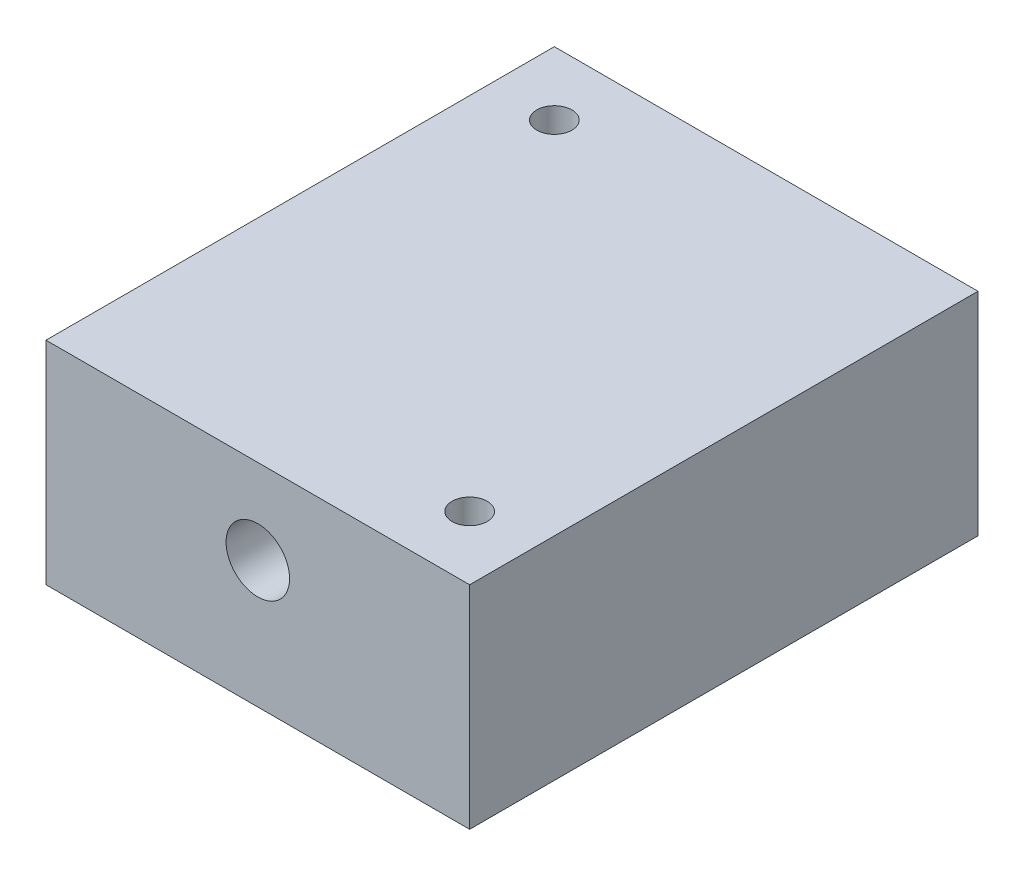
ISO-10303-21;
HEADER;
FILE_DESCRIPTION(('STEP AP214'),'2;1');
FILE_NAME('part.step','',(''),(''),'','','');
FILE_SCHEMA(('AUTOMOTIVE_DESIGN { 1 0 10303 214 1 1 1 1 }'));
ENDSEC;
DATA;
#1=APPLICATION_CONTEXT('core data for automotive mechanical design processes');
#2=APPLICATION_PROTOCOL_DEFINITION('international standard','automotive_design',2000,#1);
#3=PRODUCT_CONTEXT('',#1,'mechanical');
#4=PRODUCT('Part','Part','',(#3));
#5=PRODUCT_RELATED_PRODUCT_CATEGORY('part','',(#4));
#6=PRODUCT_DEFINITION_FORMATION('','',#4);
#7=PRODUCT_DEFINITION_CONTEXT('part definition',#1,'design');
#8=PRODUCT_DEFINITION('design','',#6,#7);
#9=PRODUCT_DEFINITION_SHAPE('','',#8);
#10=(LENGTH_UNIT() NAMED_UNIT(*) SI_UNIT(.MILLI.,.METRE.));
#11=(NAMED_UNIT(*) PLANE_ANGLE_UNIT() SI_UNIT($,.RADIAN.));
#12=(NAMED_UNIT(*) SI_UNIT($,.STERADIAN.) SOLID_ANGLE_UNIT());
#13=UNCERTAINTY_MEASURE_WITH_UNIT(LENGTH_MEASURE(1.E-05),#10,'distance_accuracy_value','');
#14=(GEOMETRIC_REPRESENTATION_CONTEXT(3) GLOBAL_UNCERTAINTY_ASSIGNED_CONTEXT((#13)) GLOBAL_UNIT_ASSIGNED_CONTEXT((#10,
#11,#12)) REPRESENTATION_CONTEXT('',''));
#15=CARTESIAN_POINT('',(0.,0.,0.));
#16=DIRECTION('',(0.,0.,1.));
#17=DIRECTION('',(1.,0.,0.));
#18=AXIS2_PLACEMENT_3D('',#15,#16,#17);
#19=CARTESIAN_POINT('',(-50.,-25.,120.));
#20=DIRECTION('',(1.,0.,0.));
#21=DIRECTION('',(0.,1.,0.));
#22=AXIS2_PLACEMENT_3D('',#19,#20,#21);
#23=PLANE('',#22);
#24=DIRECTION('',(0.,-1.,0.));
#25=VECTOR('',#24,1.);
#26=CARTESIAN_POINT('',(-50.,-25.,0.));
#27=LINE('',#26,#25);
#28=CARTESIAN_POINT('',(-50.,25.,0.));
#29=VERTEX_POINT('',#28);
#30=CARTESIAN_POINT('',(-50.,-25.,0.));
#31=VERTEX_POINT('',#30);
#32=EDGE_CURVE('E110',#29,#31,#27,.T.);
#33=ORIENTED_EDGE('',*,*,#32,.T.);
#34=DIRECTION('',(0.,0.,-1.));
#35=VECTOR('',#34,1.);
#36=CARTESIAN_POINT('',(-50.,-25.,120.));
#37=LINE('',#36,#35);
#38=CARTESIAN_POINT('',(-50.,-25.,120.));
#39=VERTEX_POINT('',#38);
#40=EDGE_CURVE('E11',#39,#31,#37,.T.);
#41=ORIENTED_EDGE('',*,*,#40,.F.);
#42=DIRECTION('',(0.,-1.,0.));
#43=VECTOR('',#42,1.);
#44=CARTESIAN_POINT('',(-50.,-25.,120.));
#45=LINE('',#44,#43);
#46=CARTESIAN_POINT('',(-50.,25.,120.));
#47=VERTEX_POINT('',#46);
#48=EDGE_CURVE('E111',#47,#39,#45,.T.);
#49=ORIENTED_EDGE('',*,*,#48,.F.);
#50=DIRECTION('',(0.,0.,-1.));
#51=VECTOR('',#50,1.);
#52=CARTESIAN_POINT('',(-50.,25.,120.));
#53=LINE('',#52,#51);
#54=EDGE_CURVE('E117',#47,#29,#53,.T.);
#55=ORIENTED_EDGE('',*,*,#54,.T.);
#56=EDGE_LOOP('',(#33,#41,#49,#55));
#57=FACE_BOUND('',#56,.T.);
#58=ADVANCED_FACE('F33',(#57),#23,.F.);
#59=CARTESIAN_POINT('',(50.,-25.,120.));
#60=DIRECTION('',(0.,1.,0.));
#61=DIRECTION('',(-1.,0.,0.));
#62=AXIS2_PLACEMENT_3D('',#59,#60,#61);
#63=PLANE('',#62);
#64=DIRECTION('',(1.,0.,0.));
#65=VECTOR('',#64,1.);
#66=CARTESIAN_POINT('',(50.,-25.,0.));
#67=LINE('',#66,#65);
#68=CARTESIAN_POINT('',(50.,-25.,0.));
#69=VERTEX_POINT('',#68);
#70=EDGE_CURVE('E120',#31,#69,#67,.T.);
#71=ORIENTED_EDGE('',*,*,#70,.T.);
#72=DIRECTION('',(0.,0.,-1.));
#73=VECTOR('',#72,1.);
#74=CARTESIAN_POINT('',(50.,-25.,120.));
#75=LINE('',#74,#73);
#76=CARTESIAN_POINT('',(50.,-25.,120.));
#77=VERTEX_POINT('',#76);
#78=EDGE_CURVE('E41',#77,#69,#75,.T.);
#79=ORIENTED_EDGE('',*,*,#78,.F.);
#80=DIRECTION('',(1.,0.,0.));
#81=VECTOR('',#80,1.);
#82=CARTESIAN_POINT('',(50.,-25.,120.));
#83=LINE('',#82,#81);
#84=EDGE_CURVE('E80',#39,#77,#83,.T.);
#85=ORIENTED_EDGE('',*,*,#84,.F.);
#86=ORIENTED_EDGE('',*,*,#40,.T.);
#87=EDGE_LOOP('',(#71,#79,#85,#86));
#88=FACE_BOUND('',#87,.T.);
#89=ADVANCED_FACE('F146',(#88),#63,.F.);
#90=CARTESIAN_POINT('',(50.,-25.,120.));
#91=DIRECTION('',(-1.,0.,0.));
#92=DIRECTION('',(0.,-1.,0.));
#93=AXIS2_PLACEMENT_3D('',#90,#91,#92);
#94=PLANE('',#93);
#95=DIRECTION('',(0.,1.,0.));
#96=VECTOR('',#95,1.);
#97=CARTESIAN_POINT('',(50.,-25.,0.));
#98=LINE('',#97,#96);
#99=CARTESIAN_POINT('',(50.,25.,0.));
#100=VERTEX_POINT('',#99);
#101=EDGE_CURVE('E67',#69,#100,#98,.T.);
#102=ORIENTED_EDGE('',*,*,#101,.T.);
#103=DIRECTION('',(0.,0.,-1.));
#104=VECTOR('',#103,1.);
#105=CARTESIAN_POINT('',(50.,25.,120.));
#106=LINE('',#105,#104);
#107=CARTESIAN_POINT('',(50.,25.,120.));
#108=VERTEX_POINT('',#107);
#109=EDGE_CURVE('E125',#108,#100,#106,.T.);
#110=ORIENTED_EDGE('',*,*,#109,.F.);
#111=DIRECTION('',(0.,1.,0.));
#112=VECTOR('',#111,1.);
#113=CARTESIAN_POINT('',(50.,-25.,120.));
#114=LINE('',#113,#112);
#115=EDGE_CURVE('E114',#77,#108,#114,.T.);
#116=ORIENTED_EDGE('',*,*,#115,.F.);
#117=ORIENTED_EDGE('',*,*,#78,.T.);
#118=EDGE_LOOP('',(#102,#110,#116,#117));
#119=FACE_BOUND('',#118,.T.);
#120=ADVANCED_FACE('F127',(#119),#94,.F.);
#121=CARTESIAN_POINT('',(50.,25.,120.));
#122=DIRECTION('',(0.,-1.,0.));
#123=DIRECTION('',(1.,0.,0.));
#124=AXIS2_PLACEMENT_3D('',#121,#122,#123);
#125=PLANE('',#124);
#126=CARTESIAN_POINT('',(35.,25.,105.));
#127=DIRECTION('',(0.,1.,0.));
#128=DIRECTION('',(0.,0.,1.));
#129=AXIS2_PLACEMENT_3D('',#126,#127,#128);
#130=CIRCLE('',#129,4.14999999999999);
#131=CARTESIAN_POINT('',(35.,25.,109.15));
#132=VERTEX_POINT('',#131);
#133=EDGE_CURVE('E98',#132,#132,#130,.T.);
#134=ORIENTED_EDGE('',*,*,#133,.F.);
#135=EDGE_LOOP('',(#134));
#136=FACE_BOUND('',#135,.T.);
#137=CARTESIAN_POINT('',(-35.,25.,15.));
#138=DIRECTION('',(0.,1.,0.));
#139=DIRECTION('',(0.,0.,1.));
#140=AXIS2_PLACEMENT_3D('',#137,#138,#139);
#141=CIRCLE('',#140,4.14999999999999);
#142=CARTESIAN_POINT('',(-35.,25.,19.15));
#143=VERTEX_POINT('',#142);
#144=EDGE_CURVE('E97',#143,#143,#141,.T.);
#145=ORIENTED_EDGE('',*,*,#144,.F.);
#146=EDGE_LOOP('',(#145));
#147=FACE_BOUND('',#146,.T.);
#148=DIRECTION('',(-1.,0.,0.));
#149=VECTOR('',#148,1.);
#150=CARTESIAN_POINT('',(50.,25.,0.));
#151=LINE('',#150,#149);
#152=EDGE_CURVE('E73',#100,#29,#151,.T.);
#153=ORIENTED_EDGE('',*,*,#152,.T.);
#154=ORIENTED_EDGE('',*,*,#54,.F.);
#155=DIRECTION('',(-1.,0.,0.));
#156=VECTOR('',#155,1.);
#157=CARTESIAN_POINT('',(50.,25.,120.));
#158=LINE('',#157,#156);
#159=EDGE_CURVE('E49',#108,#47,#158,.T.);
#160=ORIENTED_EDGE('',*,*,#159,.F.);
#161=ORIENTED_EDGE('',*,*,#109,.T.);
#162=EDGE_LOOP('',(#153,#154,#160,#161));
#163=FACE_BOUND('',#162,.T.);
#164=ADVANCED_FACE('F134',(#136,#147,#163),#125,.F.);
#165=CARTESIAN_POINT('',(0.,0.,120.));
#166=DIRECTION('',(0.,0.,1.));
#167=DIRECTION('',(1.,0.,0.));
#168=AXIS2_PLACEMENT_3D('',#165,#166,#167);
#169=PLANE('',#168);
#170=CARTESIAN_POINT('',(4.44444443054026E-06,5.00000000000007,120.));
#171=DIRECTION('',(0.,0.,1.));
#172=DIRECTION('',(1.,0.,0.));
#173=AXIS2_PLACEMENT_3D('',#170,#171,#172);
#174=CIRCLE('',#173,7.5);
#175=CARTESIAN_POINT('',(7.50000444444443,5.00000000000007,120.));
#176=VERTEX_POINT('',#175);
#177=EDGE_CURVE('E247',#176,#176,#174,.T.);
#178=ORIENTED_EDGE('',*,*,#177,.F.);
#179=EDGE_LOOP('',(#178));
#180=FACE_BOUND('',#179,.T.);
#181=ORIENTED_EDGE('',*,*,#48,.T.);
#182=ORIENTED_EDGE('',*,*,#84,.T.);
#183=ORIENTED_EDGE('',*,*,#115,.T.);
#184=ORIENTED_EDGE('',*,*,#159,.T.);
#185=EDGE_LOOP('',(#181,#182,#183,#184));
#186=FACE_BOUND('',#185,.T.);
#187=ADVANCED_FACE('F136',(#180,#186),#169,.T.);
#188=CARTESIAN_POINT('',(0.,0.,0.));
#189=DIRECTION('',(0.,0.,1.));
#190=DIRECTION('',(1.,0.,0.));
#191=AXIS2_PLACEMENT_3D('',#188,#189,#190);
#192=PLANE('',#191);
#193=CARTESIAN_POINT('',(4.44444443054026E-06,5.00000000000007,0.));
#194=DIRECTION('',(0.,0.,1.));
#195=DIRECTION('',(1.,0.,0.));
#196=AXIS2_PLACEMENT_3D('',#193,#194,#195);
#197=CIRCLE('',#196,4.49999999999997);
#198=CARTESIAN_POINT('',(4.5000044444444,5.00000000000007,0.));
#199=VERTEX_POINT('',#198);
#200=EDGE_CURVE('E104',#199,#199,#197,.T.);
#201=ORIENTED_EDGE('',*,*,#200,.T.);
#202=EDGE_LOOP('',(#201));
#203=FACE_BOUND('',#202,.T.);
#204=ORIENTED_EDGE('',*,*,#32,.F.);
#205=ORIENTED_EDGE('',*,*,#152,.F.);
#206=ORIENTED_EDGE('',*,*,#101,.F.);
#207=ORIENTED_EDGE('',*,*,#70,.F.);
#208=EDGE_LOOP('',(#204,#205,#206,#207));
#209=FACE_BOUND('',#208,.T.);
#210=ADVANCED_FACE('F130',(#203,#209),#192,.F.);
#211=CARTESIAN_POINT('',(-35.,5.,15.));
#212=DIRECTION('',(0.,1.,0.));
#213=DIRECTION('',(0.,0.,1.));
#214=AXIS2_PLACEMENT_3D('',#211,#212,#213);
#215=CONICAL_SURFACE('',#214,4.14999999999999,1.02974425867665);
#216=CARTESIAN_POINT('',(-35.,2.50642843103562,15.));
#217=VERTEX_POINT('',#216);
#218=VERTEX_LOOP('',#217);
#219=FACE_BOUND('',#218,.T.);
#220=CARTESIAN_POINT('',(-35.,5.,15.));
#221=DIRECTION('',(0.,1.,0.));
#222=DIRECTION('',(0.,0.,1.));
#223=AXIS2_PLACEMENT_3D('',#220,#221,#222);
#224=CIRCLE('',#223,4.14999999999999);
#225=CARTESIAN_POINT('',(-35.,5.,19.15));
#226=VERTEX_POINT('',#225);
#227=EDGE_CURVE('E101',#226,#226,#224,.T.);
#228=ORIENTED_EDGE('',*,*,#227,.T.);
#229=EDGE_LOOP('',(#228));
#230=FACE_BOUND('',#229,.T.);
#231=ADVANCED_FACE('F171',(#219,#230),#215,.F.);
#232=CARTESIAN_POINT('',(-35.,25.,15.));
#233=DIRECTION('',(0.,1.,0.));
#234=DIRECTION('',(0.,0.,1.));
#235=AXIS2_PLACEMENT_3D('',#232,#233,#234);
#236=CYLINDRICAL_SURFACE('',#235,4.14999999999999);
#237=ORIENTED_EDGE('',*,*,#227,.F.);
#238=EDGE_LOOP('',(#237));
#239=FACE_BOUND('',#238,.T.);
#240=ORIENTED_EDGE('',*,*,#144,.T.);
#241=EDGE_LOOP('',(#240));
#242=FACE_BOUND('',#241,.T.);
#243=ADVANCED_FACE('F91',(#239,#242),#236,.F.);
#244=CARTESIAN_POINT('',(35.,5.,105.));
#245=DIRECTION('',(0.,1.,0.));
#246=DIRECTION('',(0.,0.,1.));
#247=AXIS2_PLACEMENT_3D('',#244,#245,#246);
#248=CONICAL_SURFACE('',#247,4.14999999999999,1.02974425867665);
#249=CARTESIAN_POINT('',(35.,2.50642843103562,105.));
#250=VERTEX_POINT('',#249);
#251=VERTEX_LOOP('',#250);
#252=FACE_BOUND('',#251,.T.);
#253=CARTESIAN_POINT('',(35.,5.,105.));
#254=DIRECTION('',(0.,1.,0.));
#255=DIRECTION('',(0.,0.,1.));
#256=AXIS2_PLACEMENT_3D('',#253,#254,#255);
#257=CIRCLE('',#256,4.14999999999999);
#258=CARTESIAN_POINT('',(35.,5.,109.15));
#259=VERTEX_POINT('',#258);
#260=EDGE_CURVE('E95',#259,#259,#257,.T.);
#261=ORIENTED_EDGE('',*,*,#260,.T.);
#262=EDGE_LOOP('',(#261));
#263=FACE_BOUND('',#262,.T.);
#264=ADVANCED_FACE('F87',(#252,#263),#248,.F.);
#265=CARTESIAN_POINT('',(35.,25.,105.));
#266=DIRECTION('',(0.,1.,0.));
#267=DIRECTION('',(0.,0.,1.));
#268=AXIS2_PLACEMENT_3D('',#265,#266,#267);
#269=CYLINDRICAL_SURFACE('',#268,4.14999999999999);
#270=ORIENTED_EDGE('',*,*,#260,.F.);
#271=EDGE_LOOP('',(#270));
#272=FACE_BOUND('',#271,.T.);
#273=ORIENTED_EDGE('',*,*,#133,.T.);
#274=EDGE_LOOP('',(#273));
#275=FACE_BOUND('',#274,.T.);
#276=ADVANCED_FACE('F90',(#272,#275),#269,.F.);
#277=CARTESIAN_POINT('',(4.44444443054026E-06,5.00000000000007,120.));
#278=DIRECTION('',(0.,0.,1.));
#279=DIRECTION('',(1.,0.,0.));
#280=AXIS2_PLACEMENT_3D('',#277,#278,#279);
#281=CYLINDRICAL_SURFACE('',#280,4.49999999999997);
#282=ORIENTED_EDGE('',*,*,#200,.F.);
#283=EDGE_LOOP('',(#282));
#284=FACE_BOUND('',#283,.T.);
#285=CARTESIAN_POINT('',(4.44444443054026E-06,5.00000000000007,3.99999999999999));
#286=DIRECTION('',(0.,0.,1.));
#287=DIRECTION('',(1.,0.,0.));
#288=AXIS2_PLACEMENT_3D('',#285,#286,#287);
#289=CIRCLE('',#288,4.49999999999997);
#290=CARTESIAN_POINT('',(4.5000044444444,5.00000000000007,3.99999999999999));
#291=VERTEX_POINT('',#290);
#292=EDGE_CURVE('E249',#291,#291,#289,.T.);
#293=ORIENTED_EDGE('',*,*,#292,.T.);
#294=EDGE_LOOP('',(#293));
#295=FACE_BOUND('',#294,.T.);
#296=ADVANCED_FACE('F201',(#284,#295),#281,.F.);
#297=CARTESIAN_POINT('',(4.5000044444444,5.00000000000007,3.99999999999999));
#298=DIRECTION('',(0.,0.,-1.));
#299=DIRECTION('',(-1.,0.,0.));
#300=AXIS2_PLACEMENT_3D('',#297,#298,#299);
#301=PLANE('',#300);
#302=ORIENTED_EDGE('',*,*,#292,.F.);
#303=EDGE_LOOP('',(#302));
#304=FACE_BOUND('',#303,.T.);
#305=CARTESIAN_POINT('',(4.44444443054026E-06,5.00000000000007,3.99999999999999));
#306=DIRECTION('',(0.,0.,1.));
#307=DIRECTION('',(1.,0.,0.));
#308=AXIS2_PLACEMENT_3D('',#305,#306,#307);
#309=CIRCLE('',#308,7.49999999999998);
#310=CARTESIAN_POINT('',(7.50000444444441,5.00000000000007,3.99999999999999));
#311=VERTEX_POINT('',#310);
#312=EDGE_CURVE('E244',#311,#311,#309,.T.);
#313=ORIENTED_EDGE('',*,*,#312,.T.);
#314=EDGE_LOOP('',(#313));
#315=FACE_BOUND('',#314,.T.);
#316=ADVANCED_FACE('F217',(#304,#315),#301,.F.);
#317=CARTESIAN_POINT('',(4.44444443054026E-06,5.00000000000007,120.));
#318=DIRECTION('',(0.,0.,1.));
#319=DIRECTION('',(1.,0.,0.));
#320=AXIS2_PLACEMENT_3D('',#317,#318,#319);
#321=CYLINDRICAL_SURFACE('',#320,7.49999999999999);
#322=ORIENTED_EDGE('',*,*,#312,.F.);
#323=EDGE_LOOP('',(#322));
#324=FACE_BOUND('',#323,.T.);
#325=ORIENTED_EDGE('',*,*,#177,.T.);
#326=EDGE_LOOP('',(#325));
#327=FACE_BOUND('',#326,.T.);
#328=ADVANCED_FACE('F227',(#324,#327),#321,.F.);
#329=CLOSED_SHELL('',(#58,#89,#120,#164,#187,#210,#231,#243,#264,#276,#296,#316,#328));
#330=MANIFOLD_SOLID_BREP('B2',#329);
#331=ADVANCED_BREP_SHAPE_REPRESENTATION('',(#18,#330),#14);
#332=SHAPE_DEFINITION_REPRESENTATION(#9,#331);
ENDSEC;
END-ISO-10303-21;
